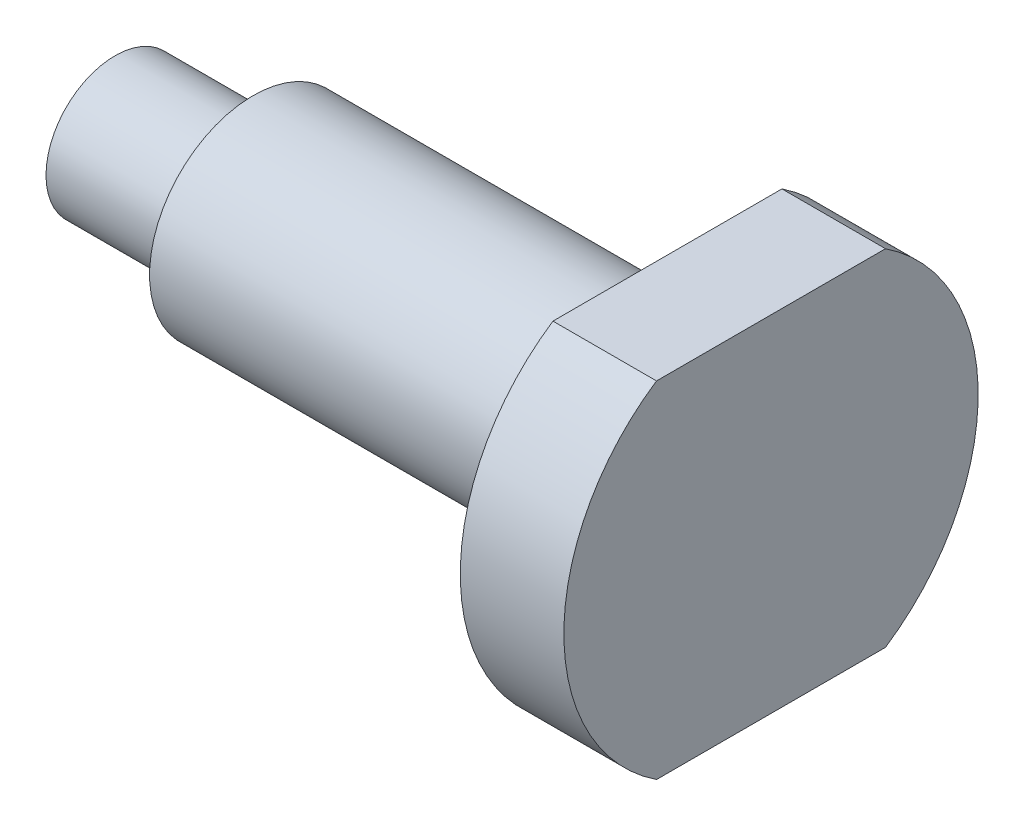
ISO-10303-21;
HEADER;
FILE_DESCRIPTION(('STEP AP214'),'2;1');
FILE_NAME('part.step','',(''),(''),'','','');
FILE_SCHEMA(('AUTOMOTIVE_DESIGN { 1 0 10303 214 1 1 1 1 }'));
ENDSEC;
DATA;
#1=APPLICATION_CONTEXT('core data for automotive mechanical design processes');
#2=APPLICATION_PROTOCOL_DEFINITION('international standard','automotive_design',2000,#1);
#3=PRODUCT_CONTEXT('',#1,'mechanical');
#4=PRODUCT('Part','Part','',(#3));
#5=PRODUCT_RELATED_PRODUCT_CATEGORY('part','',(#4));
#6=PRODUCT_DEFINITION_FORMATION('','',#4);
#7=PRODUCT_DEFINITION_CONTEXT('part definition',#1,'design');
#8=PRODUCT_DEFINITION('design','',#6,#7);
#9=PRODUCT_DEFINITION_SHAPE('','',#8);
#10=(LENGTH_UNIT() NAMED_UNIT(*) SI_UNIT(.MILLI.,.METRE.));
#11=(NAMED_UNIT(*) PLANE_ANGLE_UNIT() SI_UNIT($,.RADIAN.));
#12=(NAMED_UNIT(*) SI_UNIT($,.STERADIAN.) SOLID_ANGLE_UNIT());
#13=UNCERTAINTY_MEASURE_WITH_UNIT(LENGTH_MEASURE(1.E-05),#10,'distance_accuracy_value','');
#14=(GEOMETRIC_REPRESENTATION_CONTEXT(3) GLOBAL_UNCERTAINTY_ASSIGNED_CONTEXT((#13)) GLOBAL_UNIT_ASSIGNED_CONTEXT((#10,
#11,#12)) REPRESENTATION_CONTEXT('',''));
#15=CARTESIAN_POINT('',(0.,0.,0.));
#16=DIRECTION('',(0.,0.,1.));
#17=DIRECTION('',(1.,0.,0.));
#18=AXIS2_PLACEMENT_3D('',#15,#16,#17);
#19=CARTESIAN_POINT('',(3.,-5.,0.));
#20=DIRECTION('',(0.,-1.,0.));
#21=DIRECTION('',(0.,0.,-1.));
#22=AXIS2_PLACEMENT_3D('',#19,#20,#21);
#23=PLANE('',#22);
#24=DIRECTION('',(0.,0.,1.));
#25=VECTOR('',#24,1.);
#26=CARTESIAN_POINT('',(0.,-5.,0.));
#27=LINE('',#26,#25);
#28=CARTESIAN_POINT('',(0.,-5.,-3.3166247903554));
#29=VERTEX_POINT('',#28);
#30=CARTESIAN_POINT('',(0.,-5.,3.3166247903554));
#31=VERTEX_POINT('',#30);
#32=EDGE_CURVE('E104',#29,#31,#27,.T.);
#33=ORIENTED_EDGE('',*,*,#32,.F.);
#34=DIRECTION('',(-1.,0.,0.));
#35=VECTOR('',#34,1.);
#36=CARTESIAN_POINT('',(3.,-5.,-3.3166247903554));
#37=LINE('',#36,#35);
#38=CARTESIAN_POINT('',(3.,-5.,-3.3166247903554));
#39=VERTEX_POINT('',#38);
#40=EDGE_CURVE('E42',#39,#29,#37,.T.);
#41=ORIENTED_EDGE('',*,*,#40,.F.);
#42=DIRECTION('',(0.,0.,1.));
#43=VECTOR('',#42,1.);
#44=CARTESIAN_POINT('',(3.,-5.,0.));
#45=LINE('',#44,#43);
#46=CARTESIAN_POINT('',(3.,-5.,3.3166247903554));
#47=VERTEX_POINT('',#46);
#48=EDGE_CURVE('E91',#39,#47,#45,.T.);
#49=ORIENTED_EDGE('',*,*,#48,.T.);
#50=DIRECTION('',(-1.,0.,0.));
#51=VECTOR('',#50,1.);
#52=CARTESIAN_POINT('',(3.,-5.,3.3166247903554));
#53=LINE('',#52,#51);
#54=EDGE_CURVE('E80',#47,#31,#53,.T.);
#55=ORIENTED_EDGE('',*,*,#54,.T.);
#56=EDGE_LOOP('',(#33,#41,#49,#55));
#57=FACE_BOUND('',#56,.T.);
#58=ADVANCED_FACE('F39',(#57),#23,.T.);
#59=CARTESIAN_POINT('',(3.,0.,0.));
#60=DIRECTION('',(-1.,0.,0.));
#61=DIRECTION('',(0.,0.,1.));
#62=AXIS2_PLACEMENT_3D('',#59,#60,#61);
#63=CYLINDRICAL_SURFACE('',#62,6.);
#64=CARTESIAN_POINT('',(0.,0.,0.));
#65=DIRECTION('',(1.,0.,0.));
#66=DIRECTION('',(0.,0.,-1.));
#67=AXIS2_PLACEMENT_3D('',#64,#65,#66);
#68=CIRCLE('',#67,6.);
#69=CARTESIAN_POINT('',(0.,5.,-3.3166247903554));
#70=VERTEX_POINT('',#69);
#71=EDGE_CURVE('E97',#29,#70,#68,.T.);
#72=ORIENTED_EDGE('',*,*,#71,.T.);
#73=DIRECTION('',(-1.,0.,0.));
#74=VECTOR('',#73,1.);
#75=CARTESIAN_POINT('',(3.,5.,-3.3166247903554));
#76=LINE('',#75,#74);
#77=CARTESIAN_POINT('',(3.,5.,-3.3166247903554));
#78=VERTEX_POINT('',#77);
#79=EDGE_CURVE('E94',#78,#70,#76,.T.);
#80=ORIENTED_EDGE('',*,*,#79,.F.);
#81=CARTESIAN_POINT('',(3.,0.,0.));
#82=DIRECTION('',(1.,0.,0.));
#83=DIRECTION('',(0.,0.,-1.));
#84=AXIS2_PLACEMENT_3D('',#81,#82,#83);
#85=CIRCLE('',#84,6.);
#86=EDGE_CURVE('E86',#39,#78,#85,.T.);
#87=ORIENTED_EDGE('',*,*,#86,.F.);
#88=ORIENTED_EDGE('',*,*,#40,.T.);
#89=EDGE_LOOP('',(#72,#80,#87,#88));
#90=FACE_BOUND('',#89,.T.);
#91=ADVANCED_FACE('F95',(#90),#63,.T.);
#92=CARTESIAN_POINT('',(3.,5.,0.));
#93=DIRECTION('',(0.,-1.,0.));
#94=DIRECTION('',(0.,0.,-1.));
#95=AXIS2_PLACEMENT_3D('',#92,#93,#94);
#96=PLANE('',#95);
#97=DIRECTION('',(0.,0.,1.));
#98=VECTOR('',#97,1.);
#99=CARTESIAN_POINT('',(0.,5.,0.));
#100=LINE('',#99,#98);
#101=CARTESIAN_POINT('',(0.,5.,3.3166247903554));
#102=VERTEX_POINT('',#101);
#103=EDGE_CURVE('E73',#70,#102,#100,.T.);
#104=ORIENTED_EDGE('',*,*,#103,.T.);
#105=DIRECTION('',(-1.,0.,0.));
#106=VECTOR('',#105,1.);
#107=CARTESIAN_POINT('',(3.,5.,3.3166247903554));
#108=LINE('',#107,#106);
#109=CARTESIAN_POINT('',(3.,5.,3.3166247903554));
#110=VERTEX_POINT('',#109);
#111=EDGE_CURVE('E98',#110,#102,#108,.T.);
#112=ORIENTED_EDGE('',*,*,#111,.F.);
#113=DIRECTION('',(0.,0.,1.));
#114=VECTOR('',#113,1.);
#115=CARTESIAN_POINT('',(3.,5.,0.));
#116=LINE('',#115,#114);
#117=EDGE_CURVE('E90',#78,#110,#116,.T.);
#118=ORIENTED_EDGE('',*,*,#117,.F.);
#119=ORIENTED_EDGE('',*,*,#79,.T.);
#120=EDGE_LOOP('',(#104,#112,#118,#119));
#121=FACE_BOUND('',#120,.T.);
#122=ADVANCED_FACE('F99',(#121),#96,.F.);
#123=CARTESIAN_POINT('',(3.,0.,0.));
#124=DIRECTION('',(-1.,0.,0.));
#125=DIRECTION('',(0.,0.,1.));
#126=AXIS2_PLACEMENT_3D('',#123,#124,#125);
#127=CYLINDRICAL_SURFACE('',#126,6.);
#128=CARTESIAN_POINT('',(0.,0.,0.));
#129=DIRECTION('',(1.,0.,0.));
#130=DIRECTION('',(0.,0.,-1.));
#131=AXIS2_PLACEMENT_3D('',#128,#129,#130);
#132=CIRCLE('',#131,6.);
#133=EDGE_CURVE('E110',#102,#31,#132,.T.);
#134=ORIENTED_EDGE('',*,*,#133,.T.);
#135=ORIENTED_EDGE('',*,*,#54,.F.);
#136=CARTESIAN_POINT('',(3.,0.,0.));
#137=DIRECTION('',(1.,0.,0.));
#138=DIRECTION('',(0.,0.,-1.));
#139=AXIS2_PLACEMENT_3D('',#136,#137,#138);
#140=CIRCLE('',#139,6.);
#141=EDGE_CURVE('E56',#110,#47,#140,.T.);
#142=ORIENTED_EDGE('',*,*,#141,.F.);
#143=ORIENTED_EDGE('',*,*,#111,.T.);
#144=EDGE_LOOP('',(#134,#135,#142,#143));
#145=FACE_BOUND('',#144,.T.);
#146=ADVANCED_FACE('F115',(#145),#127,.T.);
#147=CARTESIAN_POINT('',(3.,0.,0.));
#148=DIRECTION('',(1.,0.,0.));
#149=DIRECTION('',(0.,0.,-1.));
#150=AXIS2_PLACEMENT_3D('',#147,#148,#149);
#151=PLANE('',#150);
#152=ORIENTED_EDGE('',*,*,#48,.F.);
#153=ORIENTED_EDGE('',*,*,#86,.T.);
#154=ORIENTED_EDGE('',*,*,#117,.T.);
#155=ORIENTED_EDGE('',*,*,#141,.T.);
#156=EDGE_LOOP('',(#152,#153,#154,#155));
#157=FACE_BOUND('',#156,.T.);
#158=ADVANCED_FACE('F88',(#157),#151,.T.);
#159=CARTESIAN_POINT('',(0.,0.,0.));
#160=DIRECTION('',(1.,0.,0.));
#161=DIRECTION('',(0.,0.,-1.));
#162=AXIS2_PLACEMENT_3D('',#159,#160,#161);
#163=PLANE('',#162);
#164=CARTESIAN_POINT('',(0.,0.,0.));
#165=DIRECTION('',(1.,0.,0.));
#166=DIRECTION('',(0.,0.,-1.));
#167=AXIS2_PLACEMENT_3D('',#164,#165,#166);
#168=CIRCLE('',#167,3.);
#169=CARTESIAN_POINT('',(0.,0.,-3.));
#170=VERTEX_POINT('',#169);
#171=EDGE_CURVE('E154',#170,#170,#168,.T.);
#172=ORIENTED_EDGE('',*,*,#171,.T.);
#173=EDGE_LOOP('',(#172));
#174=FACE_BOUND('',#173,.T.);
#175=ORIENTED_EDGE('',*,*,#32,.T.);
#176=ORIENTED_EDGE('',*,*,#133,.F.);
#177=ORIENTED_EDGE('',*,*,#103,.F.);
#178=ORIENTED_EDGE('',*,*,#71,.F.);
#179=EDGE_LOOP('',(#175,#176,#177,#178));
#180=FACE_BOUND('',#179,.T.);
#181=ADVANCED_FACE('F117',(#174,#180),#163,.F.);
#182=CARTESIAN_POINT('',(-12.,0.,0.));
#183=DIRECTION('',(1.,0.,0.));
#184=DIRECTION('',(0.,0.,-1.));
#185=AXIS2_PLACEMENT_3D('',#182,#183,#184);
#186=CYLINDRICAL_SURFACE('',#185,3.);
#187=CARTESIAN_POINT('',(-12.,0.,0.));
#188=DIRECTION('',(1.,0.,0.));
#189=DIRECTION('',(0.,0.,-1.));
#190=AXIS2_PLACEMENT_3D('',#187,#188,#189);
#191=CIRCLE('',#190,3.);
#192=CARTESIAN_POINT('',(-12.,0.,-3.));
#193=VERTEX_POINT('',#192);
#194=EDGE_CURVE('E107',#193,#193,#191,.T.);
#195=ORIENTED_EDGE('',*,*,#194,.T.);
#196=EDGE_LOOP('',(#195));
#197=FACE_BOUND('',#196,.T.);
#198=ORIENTED_EDGE('',*,*,#171,.F.);
#199=EDGE_LOOP('',(#198));
#200=FACE_BOUND('',#199,.T.);
#201=ADVANCED_FACE('F131',(#197,#200),#186,.T.);
#202=CARTESIAN_POINT('',(-12.,0.,0.));
#203=DIRECTION('',(1.,0.,0.));
#204=DIRECTION('',(0.,0.,-1.));
#205=AXIS2_PLACEMENT_3D('',#202,#203,#204);
#206=PLANE('',#205);
#207=CARTESIAN_POINT('',(-12.,0.,0.));
#208=DIRECTION('',(-1.,0.,0.));
#209=DIRECTION('',(0.,0.,1.));
#210=AXIS2_PLACEMENT_3D('',#207,#208,#209);
#211=CIRCLE('',#210,2.);
#212=CARTESIAN_POINT('',(-12.,0.,2.));
#213=VERTEX_POINT('',#212);
#214=EDGE_CURVE('E11',#213,#213,#211,.T.);
#215=ORIENTED_EDGE('',*,*,#214,.F.);
#216=EDGE_LOOP('',(#215));
#217=FACE_BOUND('',#216,.T.);
#218=ORIENTED_EDGE('',*,*,#194,.F.);
#219=EDGE_LOOP('',(#218));
#220=FACE_BOUND('',#219,.T.);
#221=ADVANCED_FACE('F137',(#217,#220),#206,.F.);
#222=CARTESIAN_POINT('',(-16.,0.,0.));
#223=DIRECTION('',(1.,0.,0.));
#224=DIRECTION('',(0.,0.,-1.));
#225=AXIS2_PLACEMENT_3D('',#222,#223,#224);
#226=CYLINDRICAL_SURFACE('',#225,2.);
#227=CARTESIAN_POINT('',(-16.,0.,0.));
#228=DIRECTION('',(-1.,0.,0.));
#229=DIRECTION('',(0.,0.,1.));
#230=AXIS2_PLACEMENT_3D('',#227,#228,#229);
#231=CIRCLE('',#230,2.);
#232=CARTESIAN_POINT('',(-16.,0.,2.));
#233=VERTEX_POINT('',#232);
#234=EDGE_CURVE('E153',#233,#233,#231,.T.);
#235=ORIENTED_EDGE('',*,*,#234,.F.);
#236=EDGE_LOOP('',(#235));
#237=FACE_BOUND('',#236,.T.);
#238=ORIENTED_EDGE('',*,*,#214,.T.);
#239=EDGE_LOOP('',(#238));
#240=FACE_BOUND('',#239,.T.);
#241=ADVANCED_FACE('F141',(#237,#240),#226,.T.);
#242=CARTESIAN_POINT('',(-16.,0.,0.));
#243=DIRECTION('',(-1.,0.,0.));
#244=DIRECTION('',(0.,0.,1.));
#245=AXIS2_PLACEMENT_3D('',#242,#243,#244);
#246=PLANE('',#245);
#247=ORIENTED_EDGE('',*,*,#234,.T.);
#248=EDGE_LOOP('',(#247));
#249=FACE_BOUND('',#248,.T.);
#250=ADVANCED_FACE('F145',(#249),#246,.T.);
#251=CLOSED_SHELL('',(#58,#91,#122,#146,#158,#181,#201,#221,#241,#250));
#252=MANIFOLD_SOLID_BREP('B2',#251);
#253=ADVANCED_BREP_SHAPE_REPRESENTATION('',(#18,#252),#14);
#254=SHAPE_DEFINITION_REPRESENTATION(#9,#253);
ENDSEC;
END-ISO-10303-21;
